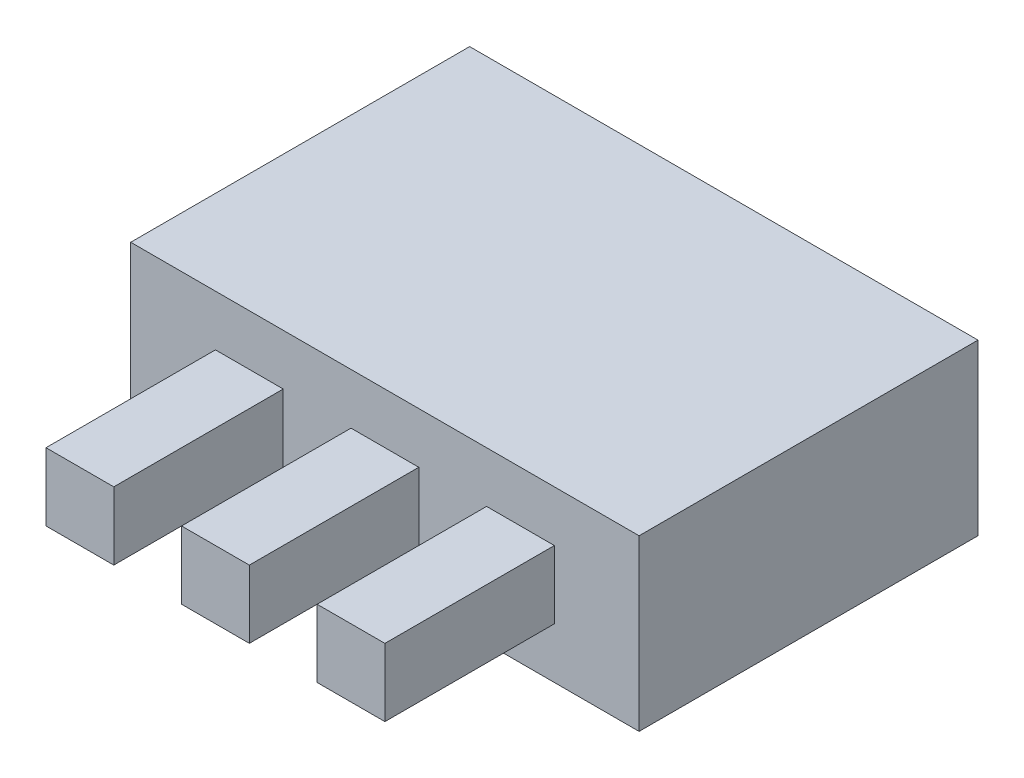
ISO-10303-21;
HEADER;
FILE_DESCRIPTION(('STEP AP214'),'2;1');
FILE_NAME('part.step','',(''),(''),'','','');
FILE_SCHEMA(('AUTOMOTIVE_DESIGN { 1 0 10303 214 1 1 1 1 }'));
ENDSEC;
DATA;
#1=APPLICATION_CONTEXT('core data for automotive mechanical design processes');
#2=APPLICATION_PROTOCOL_DEFINITION('international standard','automotive_design',2000,#1);
#3=PRODUCT_CONTEXT('',#1,'mechanical');
#4=PRODUCT('Part','Part','',(#3));
#5=PRODUCT_RELATED_PRODUCT_CATEGORY('part','',(#4));
#6=PRODUCT_DEFINITION_FORMATION('','',#4);
#7=PRODUCT_DEFINITION_CONTEXT('part definition',#1,'design');
#8=PRODUCT_DEFINITION('design','',#6,#7);
#9=PRODUCT_DEFINITION_SHAPE('','',#8);
#10=(LENGTH_UNIT() NAMED_UNIT(*) SI_UNIT(.MILLI.,.METRE.));
#11=(NAMED_UNIT(*) PLANE_ANGLE_UNIT() SI_UNIT($,.RADIAN.));
#12=(NAMED_UNIT(*) SI_UNIT($,.STERADIAN.) SOLID_ANGLE_UNIT());
#13=UNCERTAINTY_MEASURE_WITH_UNIT(LENGTH_MEASURE(1.E-05),#10,'distance_accuracy_value','');
#14=(GEOMETRIC_REPRESENTATION_CONTEXT(3) GLOBAL_UNCERTAINTY_ASSIGNED_CONTEXT((#13)) GLOBAL_UNIT_ASSIGNED_CONTEXT((#10,
#11,#12)) REPRESENTATION_CONTEXT('',''));
#15=CARTESIAN_POINT('',(0.,0.,0.));
#16=DIRECTION('',(0.,0.,1.));
#17=DIRECTION('',(1.,0.,0.));
#18=AXIS2_PLACEMENT_3D('',#15,#16,#17);
#19=CARTESIAN_POINT('',(0.,0.,10.));
#20=DIRECTION('',(0.,0.,1.));
#21=DIRECTION('',(1.,0.,0.));
#22=AXIS2_PLACEMENT_3D('',#19,#20,#21);
#23=PLANE('',#22);
#24=DIRECTION('',(-1.,0.,0.));
#25=VECTOR('',#24,1.);
#26=CARTESIAN_POINT('',(0.,1.,10.));
#27=LINE('',#26,#25);
#28=CARTESIAN_POINT('',(5.,1.,10.));
#29=VERTEX_POINT('',#28);
#30=CARTESIAN_POINT('',(3.,1.,10.));
#31=VERTEX_POINT('',#30);
#32=EDGE_CURVE('E160',#29,#31,#27,.T.);
#33=ORIENTED_EDGE('',*,*,#32,.F.);
#34=DIRECTION('',(0.,-1.,0.));
#35=VECTOR('',#34,1.);
#36=CARTESIAN_POINT('',(5.,0.,10.));
#37=LINE('',#36,#35);
#38=CARTESIAN_POINT('',(5.,-1.,10.));
#39=VERTEX_POINT('',#38);
#40=EDGE_CURVE('E165',#29,#39,#37,.T.);
#41=ORIENTED_EDGE('',*,*,#40,.T.);
#42=DIRECTION('',(-1.,0.,0.));
#43=VECTOR('',#42,1.);
#44=CARTESIAN_POINT('',(0.,-1.,10.));
#45=LINE('',#44,#43);
#46=CARTESIAN_POINT('',(3.,-1.,10.));
#47=VERTEX_POINT('',#46);
#48=EDGE_CURVE('E197',#39,#47,#45,.T.);
#49=ORIENTED_EDGE('',*,*,#48,.T.);
#50=DIRECTION('',(0.,-1.,0.));
#51=VECTOR('',#50,1.);
#52=CARTESIAN_POINT('',(3.,0.,10.));
#53=LINE('',#52,#51);
#54=EDGE_CURVE('E201',#31,#47,#53,.T.);
#55=ORIENTED_EDGE('',*,*,#54,.F.);
#56=EDGE_LOOP('',(#33,#41,#49,#55));
#57=FACE_BOUND('',#56,.T.);
#58=DIRECTION('',(-1.,0.,0.));
#59=VECTOR('',#58,1.);
#60=CARTESIAN_POINT('',(0.,0.999999999999972,10.));
#61=LINE('',#60,#59);
#62=CARTESIAN_POINT('',(-3.,0.999999999999972,10.));
#63=VERTEX_POINT('',#62);
#64=CARTESIAN_POINT('',(-5.,0.999999999999972,10.));
#65=VERTEX_POINT('',#64);
#66=EDGE_CURVE('E290',#63,#65,#61,.T.);
#67=ORIENTED_EDGE('',*,*,#66,.F.);
#68=DIRECTION('',(0.,-1.,0.));
#69=VECTOR('',#68,1.);
#70=CARTESIAN_POINT('',(-3.,0.,10.));
#71=LINE('',#70,#69);
#72=CARTESIAN_POINT('',(-3.,-1.00000000000003,10.));
#73=VERTEX_POINT('',#72);
#74=EDGE_CURVE('E279',#63,#73,#71,.T.);
#75=ORIENTED_EDGE('',*,*,#74,.T.);
#76=DIRECTION('',(-1.,0.,0.));
#77=VECTOR('',#76,1.);
#78=CARTESIAN_POINT('',(0.,-1.00000000000003,10.));
#79=LINE('',#78,#77);
#80=CARTESIAN_POINT('',(-5.,-1.00000000000003,10.));
#81=VERTEX_POINT('',#80);
#82=EDGE_CURVE('E283',#73,#81,#79,.T.);
#83=ORIENTED_EDGE('',*,*,#82,.T.);
#84=DIRECTION('',(0.,-1.,0.));
#85=VECTOR('',#84,1.);
#86=CARTESIAN_POINT('',(-5.,0.,10.));
#87=LINE('',#86,#85);
#88=EDGE_CURVE('E287',#65,#81,#87,.T.);
#89=ORIENTED_EDGE('',*,*,#88,.F.);
#90=EDGE_LOOP('',(#67,#75,#83,#89));
#91=FACE_BOUND('',#90,.T.);
#92=DIRECTION('',(1.,0.,0.));
#93=VECTOR('',#92,1.);
#94=CARTESIAN_POINT('',(0.,-2.5,10.));
#95=LINE('',#94,#93);
#96=CARTESIAN_POINT('',(-7.5,-2.5,10.));
#97=VERTEX_POINT('',#96);
#98=CARTESIAN_POINT('',(7.5,-2.5,10.));
#99=VERTEX_POINT('',#98);
#100=EDGE_CURVE('E294',#97,#99,#95,.T.);
#101=ORIENTED_EDGE('',*,*,#100,.T.);
#102=DIRECTION('',(0.,1.,0.));
#103=VECTOR('',#102,1.);
#104=CARTESIAN_POINT('',(7.5,0.,10.));
#105=LINE('',#104,#103);
#106=CARTESIAN_POINT('',(7.5,2.5,10.));
#107=VERTEX_POINT('',#106);
#108=EDGE_CURVE('E298',#99,#107,#105,.T.);
#109=ORIENTED_EDGE('',*,*,#108,.T.);
#110=DIRECTION('',(1.,0.,0.));
#111=VECTOR('',#110,1.);
#112=CARTESIAN_POINT('',(0.,2.5,10.));
#113=LINE('',#112,#111);
#114=CARTESIAN_POINT('',(-7.5,2.5,10.));
#115=VERTEX_POINT('',#114);
#116=EDGE_CURVE('E302',#115,#107,#113,.T.);
#117=ORIENTED_EDGE('',*,*,#116,.F.);
#118=DIRECTION('',(0.,1.,0.));
#119=VECTOR('',#118,1.);
#120=CARTESIAN_POINT('',(-7.5,0.,10.));
#121=LINE('',#120,#119);
#122=EDGE_CURVE('E306',#97,#115,#121,.T.);
#123=ORIENTED_EDGE('',*,*,#122,.F.);
#124=EDGE_LOOP('',(#101,#109,#117,#123));
#125=FACE_BOUND('',#124,.T.);
#126=DIRECTION('',(0.,-1.,0.));
#127=VECTOR('',#126,1.);
#128=CARTESIAN_POINT('',(1.,0.,10.));
#129=LINE('',#128,#127);
#130=CARTESIAN_POINT('',(1.,1.,10.));
#131=VERTEX_POINT('',#130);
#132=CARTESIAN_POINT('',(1.,-1.,10.));
#133=VERTEX_POINT('',#132);
#134=EDGE_CURVE('E63',#131,#133,#129,.T.);
#135=ORIENTED_EDGE('',*,*,#134,.T.);
#136=DIRECTION('',(-1.,0.,0.));
#137=VECTOR('',#136,1.);
#138=CARTESIAN_POINT('',(0.,-1.,10.));
#139=LINE('',#138,#137);
#140=CARTESIAN_POINT('',(-0.999999999999998,-1.,10.));
#141=VERTEX_POINT('',#140);
#142=EDGE_CURVE('E247',#133,#141,#139,.T.);
#143=ORIENTED_EDGE('',*,*,#142,.T.);
#144=DIRECTION('',(0.,-1.,0.));
#145=VECTOR('',#144,1.);
#146=CARTESIAN_POINT('',(-0.999999999999998,0.,10.));
#147=LINE('',#146,#145);
#148=CARTESIAN_POINT('',(-0.999999999999998,1.,10.));
#149=VERTEX_POINT('',#148);
#150=EDGE_CURVE('E237',#149,#141,#147,.T.);
#151=ORIENTED_EDGE('',*,*,#150,.F.);
#152=DIRECTION('',(-1.,0.,0.));
#153=VECTOR('',#152,1.);
#154=CARTESIAN_POINT('',(0.,1.,10.));
#155=LINE('',#154,#153);
#156=EDGE_CURVE('E241',#131,#149,#155,.T.);
#157=ORIENTED_EDGE('',*,*,#156,.F.);
#158=EDGE_LOOP('',(#135,#143,#151,#157));
#159=FACE_BOUND('',#158,.T.);
#160=ADVANCED_FACE('F39',(#57,#91,#125,#159),#23,.T.);
#161=CARTESIAN_POINT('',(0.,-2.5,10.));
#162=DIRECTION('',(0.,1.,0.));
#163=DIRECTION('',(0.,0.,1.));
#164=AXIS2_PLACEMENT_3D('',#161,#162,#163);
#165=PLANE('',#164);
#166=DIRECTION('',(1.,0.,0.));
#167=VECTOR('',#166,1.);
#168=CARTESIAN_POINT('',(0.,-2.5,0.));
#169=LINE('',#168,#167);
#170=CARTESIAN_POINT('',(-7.5,-2.5,0.));
#171=VERTEX_POINT('',#170);
#172=CARTESIAN_POINT('',(7.5,-2.5,0.));
#173=VERTEX_POINT('',#172);
#174=EDGE_CURVE('E293',#171,#173,#169,.T.);
#175=ORIENTED_EDGE('',*,*,#174,.T.);
#176=DIRECTION('',(0.,0.,-1.));
#177=VECTOR('',#176,1.);
#178=CARTESIAN_POINT('',(7.5,-2.5,10.));
#179=LINE('',#178,#177);
#180=EDGE_CURVE('E11',#99,#173,#179,.T.);
#181=ORIENTED_EDGE('',*,*,#180,.F.);
#182=ORIENTED_EDGE('',*,*,#100,.F.);
#183=DIRECTION('',(0.,0.,-1.));
#184=VECTOR('',#183,1.);
#185=CARTESIAN_POINT('',(-7.5,-2.5,10.));
#186=LINE('',#185,#184);
#187=EDGE_CURVE('E310',#97,#171,#186,.T.);
#188=ORIENTED_EDGE('',*,*,#187,.T.);
#189=EDGE_LOOP('',(#175,#181,#182,#188));
#190=FACE_BOUND('',#189,.T.);
#191=ADVANCED_FACE('F41',(#190),#165,.F.);
#192=CARTESIAN_POINT('',(7.5,0.,10.));
#193=DIRECTION('',(-1.,0.,0.));
#194=DIRECTION('',(0.,0.,1.));
#195=AXIS2_PLACEMENT_3D('',#192,#193,#194);
#196=PLANE('',#195);
#197=DIRECTION('',(0.,1.,0.));
#198=VECTOR('',#197,1.);
#199=CARTESIAN_POINT('',(7.5,0.,0.));
#200=LINE('',#199,#198);
#201=CARTESIAN_POINT('',(7.5,2.5,0.));
#202=VERTEX_POINT('',#201);
#203=EDGE_CURVE('E314',#173,#202,#200,.T.);
#204=ORIENTED_EDGE('',*,*,#203,.T.);
#205=DIRECTION('',(0.,0.,-1.));
#206=VECTOR('',#205,1.);
#207=CARTESIAN_POINT('',(7.5,2.5,10.));
#208=LINE('',#207,#206);
#209=EDGE_CURVE('E48',#107,#202,#208,.T.);
#210=ORIENTED_EDGE('',*,*,#209,.F.);
#211=ORIENTED_EDGE('',*,*,#108,.F.);
#212=ORIENTED_EDGE('',*,*,#180,.T.);
#213=EDGE_LOOP('',(#204,#210,#211,#212));
#214=FACE_BOUND('',#213,.T.);
#215=ADVANCED_FACE('F336',(#214),#196,.F.);
#216=CARTESIAN_POINT('',(0.,2.5,10.));
#217=DIRECTION('',(0.,1.,0.));
#218=DIRECTION('',(0.,0.,1.));
#219=AXIS2_PLACEMENT_3D('',#216,#217,#218);
#220=PLANE('',#219);
#221=DIRECTION('',(1.,0.,0.));
#222=VECTOR('',#221,1.);
#223=CARTESIAN_POINT('',(0.,2.5,0.));
#224=LINE('',#223,#222);
#225=CARTESIAN_POINT('',(-7.5,2.5,0.));
#226=VERTEX_POINT('',#225);
#227=EDGE_CURVE('E318',#226,#202,#224,.T.);
#228=ORIENTED_EDGE('',*,*,#227,.F.);
#229=DIRECTION('',(0.,0.,-1.));
#230=VECTOR('',#229,1.);
#231=CARTESIAN_POINT('',(-7.5,2.5,10.));
#232=LINE('',#231,#230);
#233=EDGE_CURVE('E327',#115,#226,#232,.T.);
#234=ORIENTED_EDGE('',*,*,#233,.F.);
#235=ORIENTED_EDGE('',*,*,#116,.T.);
#236=ORIENTED_EDGE('',*,*,#209,.T.);
#237=EDGE_LOOP('',(#228,#234,#235,#236));
#238=FACE_BOUND('',#237,.T.);
#239=ADVANCED_FACE('F333',(#238),#220,.T.);
#240=CARTESIAN_POINT('',(-7.5,0.,10.));
#241=DIRECTION('',(-1.,0.,0.));
#242=DIRECTION('',(0.,0.,1.));
#243=AXIS2_PLACEMENT_3D('',#240,#241,#242);
#244=PLANE('',#243);
#245=DIRECTION('',(0.,1.,0.));
#246=VECTOR('',#245,1.);
#247=CARTESIAN_POINT('',(-7.5,0.,0.));
#248=LINE('',#247,#246);
#249=EDGE_CURVE('E299',#171,#226,#248,.T.);
#250=ORIENTED_EDGE('',*,*,#249,.F.);
#251=ORIENTED_EDGE('',*,*,#187,.F.);
#252=ORIENTED_EDGE('',*,*,#122,.T.);
#253=ORIENTED_EDGE('',*,*,#233,.T.);
#254=EDGE_LOOP('',(#250,#251,#252,#253));
#255=FACE_BOUND('',#254,.T.);
#256=ADVANCED_FACE('F343',(#255),#244,.T.);
#257=CARTESIAN_POINT('',(0.,0.,0.));
#258=DIRECTION('',(0.,0.,1.));
#259=DIRECTION('',(1.,0.,0.));
#260=AXIS2_PLACEMENT_3D('',#257,#258,#259);
#261=PLANE('',#260);
#262=ORIENTED_EDGE('',*,*,#174,.F.);
#263=ORIENTED_EDGE('',*,*,#249,.T.);
#264=ORIENTED_EDGE('',*,*,#227,.T.);
#265=ORIENTED_EDGE('',*,*,#203,.F.);
#266=EDGE_LOOP('',(#262,#263,#264,#265));
#267=FACE_BOUND('',#266,.T.);
#268=ADVANCED_FACE('F340',(#267),#261,.F.);
#269=CARTESIAN_POINT('',(0.,0.999999999999972,15.));
#270=DIRECTION('',(0.,1.,0.));
#271=DIRECTION('',(0.,0.,1.));
#272=AXIS2_PLACEMENT_3D('',#269,#270,#271);
#273=PLANE('',#272);
#274=DIRECTION('',(0.,0.,-1.));
#275=VECTOR('',#274,1.);
#276=CARTESIAN_POINT('',(-3.,0.999999999999972,15.));
#277=LINE('',#276,#275);
#278=CARTESIAN_POINT('',(-3.,0.999999999999972,15.));
#279=VERTEX_POINT('',#278);
#280=EDGE_CURVE('E264',#279,#63,#277,.T.);
#281=ORIENTED_EDGE('',*,*,#280,.T.);
#282=ORIENTED_EDGE('',*,*,#66,.T.);
#283=DIRECTION('',(0.,0.,-1.));
#284=VECTOR('',#283,1.);
#285=CARTESIAN_POINT('',(-5.,0.999999999999972,15.));
#286=LINE('',#285,#284);
#287=CARTESIAN_POINT('',(-5.,0.999999999999972,15.));
#288=VERTEX_POINT('',#287);
#289=EDGE_CURVE('E275',#288,#65,#286,.T.);
#290=ORIENTED_EDGE('',*,*,#289,.F.);
#291=DIRECTION('',(1.,0.,0.));
#292=VECTOR('',#291,1.);
#293=CARTESIAN_POINT('',(0.,0.999999999999972,15.));
#294=LINE('',#293,#292);
#295=EDGE_CURVE('E250',#288,#279,#294,.T.);
#296=ORIENTED_EDGE('',*,*,#295,.T.);
#297=EDGE_LOOP('',(#281,#282,#290,#296));
#298=FACE_BOUND('',#297,.T.);
#299=ADVANCED_FACE('F360',(#298),#273,.T.);
#300=CARTESIAN_POINT('',(-5.,0.,15.));
#301=DIRECTION('',(-1.,0.,0.));
#302=DIRECTION('',(0.,0.,1.));
#303=AXIS2_PLACEMENT_3D('',#300,#301,#302);
#304=PLANE('',#303);
#305=ORIENTED_EDGE('',*,*,#289,.T.);
#306=ORIENTED_EDGE('',*,*,#88,.T.);
#307=DIRECTION('',(0.,0.,-1.));
#308=VECTOR('',#307,1.);
#309=CARTESIAN_POINT('',(-5.,-1.00000000000003,15.));
#310=LINE('',#309,#308);
#311=CARTESIAN_POINT('',(-5.,-1.00000000000003,15.));
#312=VERTEX_POINT('',#311);
#313=EDGE_CURVE('E271',#312,#81,#310,.T.);
#314=ORIENTED_EDGE('',*,*,#313,.F.);
#315=DIRECTION('',(0.,1.,0.));
#316=VECTOR('',#315,1.);
#317=CARTESIAN_POINT('',(-5.,0.,15.));
#318=LINE('',#317,#316);
#319=EDGE_CURVE('E254',#312,#288,#318,.T.);
#320=ORIENTED_EDGE('',*,*,#319,.T.);
#321=EDGE_LOOP('',(#305,#306,#314,#320));
#322=FACE_BOUND('',#321,.T.);
#323=ADVANCED_FACE('F385',(#322),#304,.T.);
#324=CARTESIAN_POINT('',(0.,-1.00000000000003,15.));
#325=DIRECTION('',(0.,1.,0.));
#326=DIRECTION('',(0.,0.,1.));
#327=AXIS2_PLACEMENT_3D('',#324,#325,#326);
#328=PLANE('',#327);
#329=ORIENTED_EDGE('',*,*,#82,.F.);
#330=DIRECTION('',(0.,0.,-1.));
#331=VECTOR('',#330,1.);
#332=CARTESIAN_POINT('',(-3.,-1.00000000000003,15.));
#333=LINE('',#332,#331);
#334=CARTESIAN_POINT('',(-3.,-1.00000000000003,15.));
#335=VERTEX_POINT('',#334);
#336=EDGE_CURVE('E268',#335,#73,#333,.T.);
#337=ORIENTED_EDGE('',*,*,#336,.F.);
#338=DIRECTION('',(1.,0.,0.));
#339=VECTOR('',#338,1.);
#340=CARTESIAN_POINT('',(0.,-1.00000000000003,15.));
#341=LINE('',#340,#339);
#342=EDGE_CURVE('E258',#312,#335,#341,.T.);
#343=ORIENTED_EDGE('',*,*,#342,.F.);
#344=ORIENTED_EDGE('',*,*,#313,.T.);
#345=EDGE_LOOP('',(#329,#337,#343,#344));
#346=FACE_BOUND('',#345,.T.);
#347=ADVANCED_FACE('F392',(#346),#328,.F.);
#348=CARTESIAN_POINT('',(-3.,0.,15.));
#349=DIRECTION('',(-1.,0.,0.));
#350=DIRECTION('',(0.,0.,1.));
#351=AXIS2_PLACEMENT_3D('',#348,#349,#350);
#352=PLANE('',#351);
#353=ORIENTED_EDGE('',*,*,#74,.F.);
#354=ORIENTED_EDGE('',*,*,#280,.F.);
#355=DIRECTION('',(0.,1.,0.));
#356=VECTOR('',#355,1.);
#357=CARTESIAN_POINT('',(-3.,0.,15.));
#358=LINE('',#357,#356);
#359=EDGE_CURVE('E261',#335,#279,#358,.T.);
#360=ORIENTED_EDGE('',*,*,#359,.F.);
#361=ORIENTED_EDGE('',*,*,#336,.T.);
#362=EDGE_LOOP('',(#353,#354,#360,#361));
#363=FACE_BOUND('',#362,.T.);
#364=ADVANCED_FACE('F399',(#363),#352,.F.);
#365=CARTESIAN_POINT('',(0.,0.,15.));
#366=DIRECTION('',(0.,0.,1.));
#367=DIRECTION('',(1.,0.,0.));
#368=AXIS2_PLACEMENT_3D('',#365,#366,#367);
#369=PLANE('',#368);
#370=ORIENTED_EDGE('',*,*,#295,.F.);
#371=ORIENTED_EDGE('',*,*,#319,.F.);
#372=ORIENTED_EDGE('',*,*,#342,.T.);
#373=ORIENTED_EDGE('',*,*,#359,.T.);
#374=EDGE_LOOP('',(#370,#371,#372,#373));
#375=FACE_BOUND('',#374,.T.);
#376=ADVANCED_FACE('F407',(#375),#369,.T.);
#377=CARTESIAN_POINT('',(0.,-1.,15.));
#378=DIRECTION('',(0.,1.,0.));
#379=DIRECTION('',(0.,0.,1.));
#380=AXIS2_PLACEMENT_3D('',#377,#378,#379);
#381=PLANE('',#380);
#382=ORIENTED_EDGE('',*,*,#142,.F.);
#383=DIRECTION('',(0.,0.,-1.));
#384=VECTOR('',#383,1.);
#385=CARTESIAN_POINT('',(1.,-1.,15.));
#386=LINE('',#385,#384);
#387=CARTESIAN_POINT('',(1.,-1.,15.));
#388=VERTEX_POINT('',#387);
#389=EDGE_CURVE('E233',#388,#133,#386,.T.);
#390=ORIENTED_EDGE('',*,*,#389,.F.);
#391=DIRECTION('',(1.,0.,0.));
#392=VECTOR('',#391,1.);
#393=CARTESIAN_POINT('',(0.,-1.,15.));
#394=LINE('',#393,#392);
#395=CARTESIAN_POINT('',(-0.999999999999998,-1.,15.));
#396=VERTEX_POINT('',#395);
#397=EDGE_CURVE('E206',#396,#388,#394,.T.);
#398=ORIENTED_EDGE('',*,*,#397,.F.);
#399=DIRECTION('',(0.,0.,-1.));
#400=VECTOR('',#399,1.);
#401=CARTESIAN_POINT('',(-0.999999999999998,-1.,15.));
#402=LINE('',#401,#400);
#403=EDGE_CURVE('E221',#396,#141,#402,.T.);
#404=ORIENTED_EDGE('',*,*,#403,.T.);
#405=EDGE_LOOP('',(#382,#390,#398,#404));
#406=FACE_BOUND('',#405,.T.);
#407=ADVANCED_FACE('F415',(#406),#381,.F.);
#408=CARTESIAN_POINT('',(1.,0.,15.));
#409=DIRECTION('',(-1.,0.,0.));
#410=DIRECTION('',(0.,0.,1.));
#411=AXIS2_PLACEMENT_3D('',#408,#409,#410);
#412=PLANE('',#411);
#413=ORIENTED_EDGE('',*,*,#134,.F.);
#414=DIRECTION('',(0.,0.,-1.));
#415=VECTOR('',#414,1.);
#416=CARTESIAN_POINT('',(1.,1.,15.));
#417=LINE('',#416,#415);
#418=CARTESIAN_POINT('',(1.,1.,15.));
#419=VERTEX_POINT('',#418);
#420=EDGE_CURVE('E229',#419,#131,#417,.T.);
#421=ORIENTED_EDGE('',*,*,#420,.F.);
#422=DIRECTION('',(0.,1.,0.));
#423=VECTOR('',#422,1.);
#424=CARTESIAN_POINT('',(1.,0.,15.));
#425=LINE('',#424,#423);
#426=EDGE_CURVE('E210',#388,#419,#425,.T.);
#427=ORIENTED_EDGE('',*,*,#426,.F.);
#428=ORIENTED_EDGE('',*,*,#389,.T.);
#429=EDGE_LOOP('',(#413,#421,#427,#428));
#430=FACE_BOUND('',#429,.T.);
#431=ADVANCED_FACE('F423',(#430),#412,.F.);
#432=CARTESIAN_POINT('',(0.,1.,15.));
#433=DIRECTION('',(0.,1.,0.));
#434=DIRECTION('',(0.,0.,1.));
#435=AXIS2_PLACEMENT_3D('',#432,#433,#434);
#436=PLANE('',#435);
#437=ORIENTED_EDGE('',*,*,#420,.T.);
#438=ORIENTED_EDGE('',*,*,#156,.T.);
#439=DIRECTION('',(0.,0.,-1.));
#440=VECTOR('',#439,1.);
#441=CARTESIAN_POINT('',(-0.999999999999998,1.,15.));
#442=LINE('',#441,#440);
#443=CARTESIAN_POINT('',(-0.999999999999998,1.,15.));
#444=VERTEX_POINT('',#443);
#445=EDGE_CURVE('E225',#444,#149,#442,.T.);
#446=ORIENTED_EDGE('',*,*,#445,.F.);
#447=DIRECTION('',(1.,0.,0.));
#448=VECTOR('',#447,1.);
#449=CARTESIAN_POINT('',(0.,1.,15.));
#450=LINE('',#449,#448);
#451=EDGE_CURVE('E213',#444,#419,#450,.T.);
#452=ORIENTED_EDGE('',*,*,#451,.T.);
#453=EDGE_LOOP('',(#437,#438,#446,#452));
#454=FACE_BOUND('',#453,.T.);
#455=ADVANCED_FACE('F431',(#454),#436,.T.);
#456=CARTESIAN_POINT('',(-0.999999999999998,0.,15.));
#457=DIRECTION('',(-1.,0.,0.));
#458=DIRECTION('',(0.,0.,1.));
#459=AXIS2_PLACEMENT_3D('',#456,#457,#458);
#460=PLANE('',#459);
#461=ORIENTED_EDGE('',*,*,#445,.T.);
#462=ORIENTED_EDGE('',*,*,#150,.T.);
#463=ORIENTED_EDGE('',*,*,#403,.F.);
#464=DIRECTION('',(0.,1.,0.));
#465=VECTOR('',#464,1.);
#466=CARTESIAN_POINT('',(-0.999999999999998,0.,15.));
#467=LINE('',#466,#465);
#468=EDGE_CURVE('E217',#396,#444,#467,.T.);
#469=ORIENTED_EDGE('',*,*,#468,.T.);
#470=EDGE_LOOP('',(#461,#462,#463,#469));
#471=FACE_BOUND('',#470,.T.);
#472=ADVANCED_FACE('F439',(#471),#460,.T.);
#473=CARTESIAN_POINT('',(0.,0.,15.));
#474=DIRECTION('',(0.,0.,1.));
#475=DIRECTION('',(1.,0.,0.));
#476=AXIS2_PLACEMENT_3D('',#473,#474,#475);
#477=PLANE('',#476);
#478=ORIENTED_EDGE('',*,*,#397,.T.);
#479=ORIENTED_EDGE('',*,*,#426,.T.);
#480=ORIENTED_EDGE('',*,*,#451,.F.);
#481=ORIENTED_EDGE('',*,*,#468,.F.);
#482=EDGE_LOOP('',(#478,#479,#480,#481));
#483=FACE_BOUND('',#482,.T.);
#484=ADVANCED_FACE('F447',(#483),#477,.T.);
#485=CARTESIAN_POINT('',(0.,1.,15.));
#486=DIRECTION('',(0.,1.,0.));
#487=DIRECTION('',(0.,0.,1.));
#488=AXIS2_PLACEMENT_3D('',#485,#486,#487);
#489=PLANE('',#488);
#490=DIRECTION('',(0.,0.,-1.));
#491=VECTOR('',#490,1.);
#492=CARTESIAN_POINT('',(5.,1.,15.));
#493=LINE('',#492,#491);
#494=CARTESIAN_POINT('',(5.,1.,15.));
#495=VERTEX_POINT('',#494);
#496=EDGE_CURVE('E187',#495,#29,#493,.T.);
#497=ORIENTED_EDGE('',*,*,#496,.T.);
#498=ORIENTED_EDGE('',*,*,#32,.T.);
#499=DIRECTION('',(0.,0.,-1.));
#500=VECTOR('',#499,1.);
#501=CARTESIAN_POINT('',(3.,1.,15.));
#502=LINE('',#501,#500);
#503=CARTESIAN_POINT('',(3.,1.,15.));
#504=VERTEX_POINT('',#503);
#505=EDGE_CURVE('E154',#504,#31,#502,.T.);
#506=ORIENTED_EDGE('',*,*,#505,.F.);
#507=DIRECTION('',(1.,0.,0.));
#508=VECTOR('',#507,1.);
#509=CARTESIAN_POINT('',(0.,1.,15.));
#510=LINE('',#509,#508);
#511=EDGE_CURVE('E158',#504,#495,#510,.T.);
#512=ORIENTED_EDGE('',*,*,#511,.T.);
#513=EDGE_LOOP('',(#497,#498,#506,#512));
#514=FACE_BOUND('',#513,.T.);
#515=ADVANCED_FACE('F157',(#514),#489,.T.);
#516=CARTESIAN_POINT('',(3.,0.,15.));
#517=DIRECTION('',(-1.,0.,0.));
#518=DIRECTION('',(0.,0.,1.));
#519=AXIS2_PLACEMENT_3D('',#516,#517,#518);
#520=PLANE('',#519);
#521=ORIENTED_EDGE('',*,*,#505,.T.);
#522=ORIENTED_EDGE('',*,*,#54,.T.);
#523=DIRECTION('',(0.,0.,-1.));
#524=VECTOR('',#523,1.);
#525=CARTESIAN_POINT('',(3.,-1.,15.));
#526=LINE('',#525,#524);
#527=CARTESIAN_POINT('',(3.,-1.,15.));
#528=VERTEX_POINT('',#527);
#529=EDGE_CURVE('E166',#528,#47,#526,.T.);
#530=ORIENTED_EDGE('',*,*,#529,.F.);
#531=DIRECTION('',(0.,1.,0.));
#532=VECTOR('',#531,1.);
#533=CARTESIAN_POINT('',(3.,0.,15.));
#534=LINE('',#533,#532);
#535=EDGE_CURVE('E171',#528,#504,#534,.T.);
#536=ORIENTED_EDGE('',*,*,#535,.T.);
#537=EDGE_LOOP('',(#521,#522,#530,#536));
#538=FACE_BOUND('',#537,.T.);
#539=ADVANCED_FACE('F176',(#538),#520,.T.);
#540=CARTESIAN_POINT('',(0.,-1.,15.));
#541=DIRECTION('',(0.,1.,0.));
#542=DIRECTION('',(0.,0.,1.));
#543=AXIS2_PLACEMENT_3D('',#540,#541,#542);
#544=PLANE('',#543);
#545=ORIENTED_EDGE('',*,*,#48,.F.);
#546=DIRECTION('',(0.,0.,-1.));
#547=VECTOR('',#546,1.);
#548=CARTESIAN_POINT('',(5.,-1.,15.));
#549=LINE('',#548,#547);
#550=CARTESIAN_POINT('',(5.,-1.,15.));
#551=VERTEX_POINT('',#550);
#552=EDGE_CURVE('E55',#551,#39,#549,.T.);
#553=ORIENTED_EDGE('',*,*,#552,.F.);
#554=DIRECTION('',(1.,0.,0.));
#555=VECTOR('',#554,1.);
#556=CARTESIAN_POINT('',(0.,-1.,15.));
#557=LINE('',#556,#555);
#558=EDGE_CURVE('E180',#528,#551,#557,.T.);
#559=ORIENTED_EDGE('',*,*,#558,.F.);
#560=ORIENTED_EDGE('',*,*,#529,.T.);
#561=EDGE_LOOP('',(#545,#553,#559,#560));
#562=FACE_BOUND('',#561,.T.);
#563=ADVANCED_FACE('F468',(#562),#544,.F.);
#564=CARTESIAN_POINT('',(5.,0.,15.));
#565=DIRECTION('',(-1.,0.,0.));
#566=DIRECTION('',(0.,0.,1.));
#567=AXIS2_PLACEMENT_3D('',#564,#565,#566);
#568=PLANE('',#567);
#569=ORIENTED_EDGE('',*,*,#40,.F.);
#570=ORIENTED_EDGE('',*,*,#496,.F.);
#571=DIRECTION('',(0.,1.,0.));
#572=VECTOR('',#571,1.);
#573=CARTESIAN_POINT('',(5.,0.,15.));
#574=LINE('',#573,#572);
#575=EDGE_CURVE('E172',#551,#495,#574,.T.);
#576=ORIENTED_EDGE('',*,*,#575,.F.);
#577=ORIENTED_EDGE('',*,*,#552,.T.);
#578=EDGE_LOOP('',(#569,#570,#576,#577));
#579=FACE_BOUND('',#578,.T.);
#580=ADVANCED_FACE('F475',(#579),#568,.F.);
#581=CARTESIAN_POINT('',(0.,0.,15.));
#582=DIRECTION('',(0.,0.,1.));
#583=DIRECTION('',(1.,0.,0.));
#584=AXIS2_PLACEMENT_3D('',#581,#582,#583);
#585=PLANE('',#584);
#586=ORIENTED_EDGE('',*,*,#511,.F.);
#587=ORIENTED_EDGE('',*,*,#535,.F.);
#588=ORIENTED_EDGE('',*,*,#558,.T.);
#589=ORIENTED_EDGE('',*,*,#575,.T.);
#590=EDGE_LOOP('',(#586,#587,#588,#589));
#591=FACE_BOUND('',#590,.T.);
#592=ADVANCED_FACE('F170',(#591),#585,.T.);
#593=CLOSED_SHELL('',(#160,#191,#215,#239,#256,#268,#299,#323,#347,#364,#376,#407,#431,#455,
#472,#484,#515,#539,#563,#580,#592));
#594=MANIFOLD_SOLID_BREP('B2',#593);
#595=ADVANCED_BREP_SHAPE_REPRESENTATION('',(#18,#594),#14);
#596=SHAPE_DEFINITION_REPRESENTATION(#9,#595);
ENDSEC;
END-ISO-10303-21;
